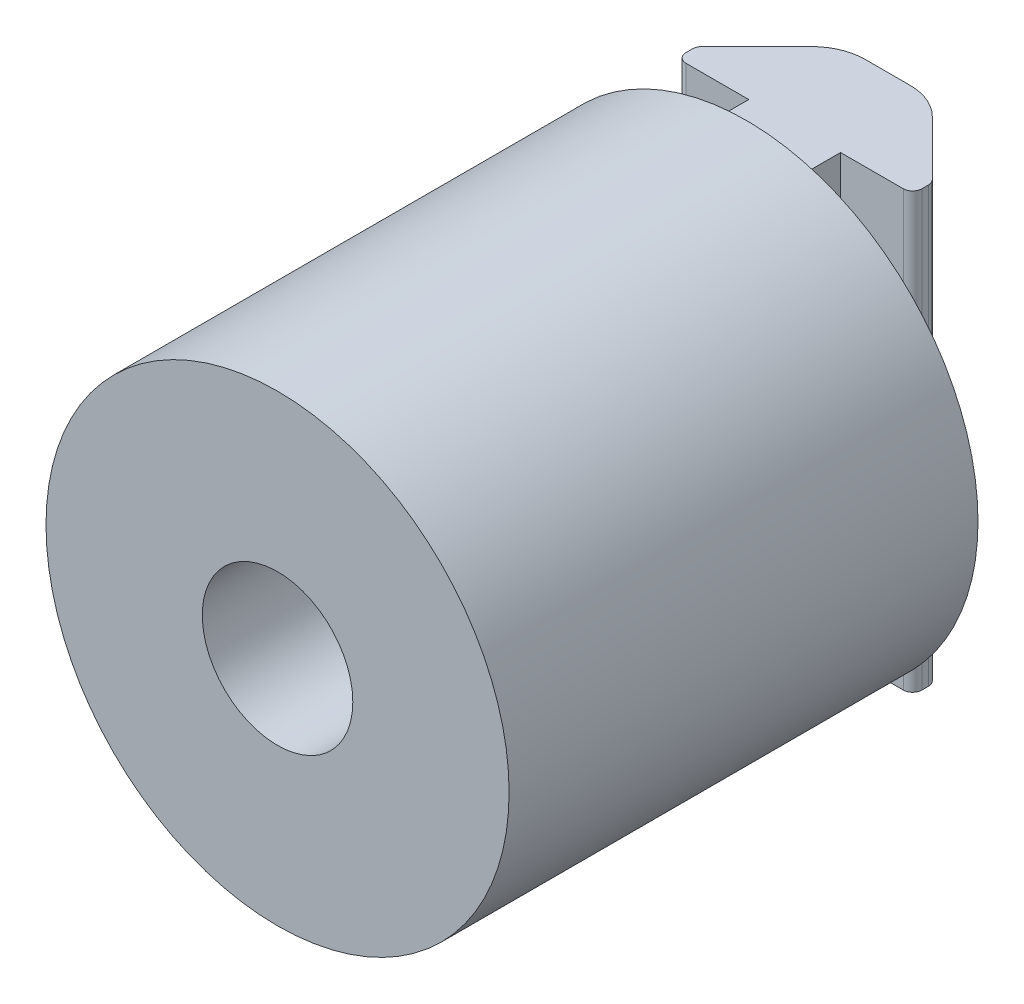
ISO-10303-21;
HEADER;
FILE_DESCRIPTION(('STEP AP214'),'2;1');
FILE_NAME('part.step','',(''),(''),'','','');
FILE_SCHEMA(('AUTOMOTIVE_DESIGN { 1 0 10303 214 1 1 1 1 }'));
ENDSEC;
DATA;
#1=APPLICATION_CONTEXT('core data for automotive mechanical design processes');
#2=APPLICATION_PROTOCOL_DEFINITION('international standard','automotive_design',2000,#1);
#3=PRODUCT_CONTEXT('',#1,'mechanical');
#4=PRODUCT('Part','Part','',(#3));
#5=PRODUCT_RELATED_PRODUCT_CATEGORY('part','',(#4));
#6=PRODUCT_DEFINITION_FORMATION('','',#4);
#7=PRODUCT_DEFINITION_CONTEXT('part definition',#1,'design');
#8=PRODUCT_DEFINITION('design','',#6,#7);
#9=PRODUCT_DEFINITION_SHAPE('','',#8);
#10=(LENGTH_UNIT() NAMED_UNIT(*) SI_UNIT(.MILLI.,.METRE.));
#11=(NAMED_UNIT(*) PLANE_ANGLE_UNIT() SI_UNIT($,.RADIAN.));
#12=(NAMED_UNIT(*) SI_UNIT($,.STERADIAN.) SOLID_ANGLE_UNIT());
#13=UNCERTAINTY_MEASURE_WITH_UNIT(LENGTH_MEASURE(1.E-05),#10,'distance_accuracy_value','');
#14=(GEOMETRIC_REPRESENTATION_CONTEXT(3) GLOBAL_UNCERTAINTY_ASSIGNED_CONTEXT((#13)) GLOBAL_UNIT_ASSIGNED_CONTEXT((#10,
#11,#12)) REPRESENTATION_CONTEXT('',''));
#15=CARTESIAN_POINT('',(0.,0.,0.));
#16=DIRECTION('',(0.,0.,1.));
#17=DIRECTION('',(1.,0.,0.));
#18=AXIS2_PLACEMENT_3D('',#15,#16,#17);
#19=CARTESIAN_POINT('',(0.,-20.,0.0999999999999792));
#20=DIRECTION('',(0.,0.,1.));
#21=DIRECTION('',(1.,0.,0.));
#22=AXIS2_PLACEMENT_3D('',#19,#20,#21);
#23=PLANE('',#22);
#24=CARTESIAN_POINT('',(0.,0.,0.0999999999999792));
#25=DIRECTION('',(0.,0.,1.));
#26=DIRECTION('',(1.,0.,0.));
#27=AXIS2_PLACEMENT_3D('',#24,#25,#26);
#28=CIRCLE('',#27,20.);
#29=CARTESIAN_POINT('',(-3.96399999999998,-19.6032319784264,0.0999999999999792));
#30=VERTEX_POINT('',#29);
#31=CARTESIAN_POINT('',(0.,-20.,0.0999999999999792));
#32=VERTEX_POINT('',#31);
#33=EDGE_CURVE('E204',#30,#32,#28,.T.);
#34=ORIENTED_EDGE('',*,*,#33,.F.);
#35=DIRECTION('',(0.,1.,0.));
#36=VECTOR('',#35,1.);
#37=CARTESIAN_POINT('',(-3.96399999999998,-20.,0.0999999999999792));
#38=LINE('',#37,#36);
#39=CARTESIAN_POINT('',(-3.96399999999998,-20.,0.0999999999999792));
#40=VERTEX_POINT('',#39);
#41=EDGE_CURVE('E202',#40,#30,#38,.T.);
#42=ORIENTED_EDGE('',*,*,#41,.F.);
#43=DIRECTION('',(1.,0.,0.));
#44=VECTOR('',#43,1.);
#45=CARTESIAN_POINT('',(0.,-20.,0.0999999999999792));
#46=LINE('',#45,#44);
#47=EDGE_CURVE('E283',#40,#32,#46,.T.);
#48=ORIENTED_EDGE('',*,*,#47,.T.);
#49=EDGE_LOOP('',(#34,#42,#48));
#50=FACE_BOUND('',#49,.T.);
#51=ADVANCED_FACE('F49',(#50),#23,.T.);
#52=CARTESIAN_POINT('',(0.,17.5,0.));
#53=DIRECTION('',(0.,1.,0.));
#54=DIRECTION('',(0.,0.,1.));
#55=AXIS2_PLACEMENT_3D('',#52,#53,#54);
#56=PLANE('',#55);
#57=DIRECTION('',(0.,0.,1.));
#58=VECTOR('',#57,1.);
#59=CARTESIAN_POINT('',(-3.96399999999998,17.5,0.));
#60=LINE('',#59,#58);
#61=CARTESIAN_POINT('',(-3.96399999999998,17.5,-4.16400000000002));
#62=VERTEX_POINT('',#61);
#63=CARTESIAN_POINT('',(-3.96399999999998,17.5,0.));
#64=VERTEX_POINT('',#63);
#65=EDGE_CURVE('E224',#62,#64,#60,.T.);
#66=ORIENTED_EDGE('',*,*,#65,.T.);
#67=DIRECTION('',(1.,0.,0.));
#68=VECTOR('',#67,1.);
#69=CARTESIAN_POINT('',(0.,17.5,0.));
#70=LINE('',#69,#68);
#71=CARTESIAN_POINT('',(3.96400000000002,17.5,0.));
#72=VERTEX_POINT('',#71);
#73=EDGE_CURVE('E58',#64,#72,#70,.T.);
#74=ORIENTED_EDGE('',*,*,#73,.T.);
#75=DIRECTION('',(0.,0.,-1.));
#76=VECTOR('',#75,1.);
#77=CARTESIAN_POINT('',(3.96400000000002,17.5,0.));
#78=LINE('',#77,#76);
#79=CARTESIAN_POINT('',(3.96400000000002,17.5,-4.16400000000002));
#80=VERTEX_POINT('',#79);
#81=EDGE_CURVE('E227',#72,#80,#78,.T.);
#82=ORIENTED_EDGE('',*,*,#81,.T.);
#83=DIRECTION('',(1.,0.,0.));
#84=VECTOR('',#83,1.);
#85=CARTESIAN_POINT('',(0.,17.5,-4.16400000000002));
#86=LINE('',#85,#84);
#87=CARTESIAN_POINT('',(9.38534251706002,17.5,-4.16400000000002));
#88=VERTEX_POINT('',#87);
#89=EDGE_CURVE('E230',#80,#88,#86,.T.);
#90=ORIENTED_EDGE('',*,*,#89,.T.);
#91=CARTESIAN_POINT('',(9.38534251706032,17.5,-4.96569999999972));
#92=DIRECTION('',(0.,1.,0.));
#93=DIRECTION('',(0.,0.,1.));
#94=AXIS2_PLACEMENT_3D('',#91,#92,#93);
#95=CIRCLE('',#94,0.801699999999698);
#96=CARTESIAN_POINT('',(10.18704251706,17.5,-4.96569999999972));
#97=VERTEX_POINT('',#96);
#98=EDGE_CURVE('E234',#88,#97,#95,.T.);
#99=ORIENTED_EDGE('',*,*,#98,.T.);
#100=DIRECTION('',(0.,0.,1.));
#101=VECTOR('',#100,1.);
#102=CARTESIAN_POINT('',(10.1870425170601,17.5,0.));
#103=LINE('',#102,#101);
#104=CARTESIAN_POINT('',(10.18704251706,17.5,-5.53395791189082));
#105=VERTEX_POINT('',#104);
#106=EDGE_CURVE('E238',#105,#97,#103,.T.);
#107=ORIENTED_EDGE('',*,*,#106,.F.);
#108=CARTESIAN_POINT('',(9.38534251706399,17.5,-5.53395791189082));
#109=DIRECTION('',(0.,1.,0.));
#110=DIRECTION('',(0.,0.,1.));
#111=AXIS2_PLACEMENT_3D('',#108,#109,#110);
#112=CIRCLE('',#111,0.80169999999602);
#113=CARTESIAN_POINT('',(9.95222932639803,17.5,-6.10084611550481));
#114=VERTEX_POINT('',#113);
#115=EDGE_CURVE('E242',#105,#114,#112,.T.);
#116=ORIENTED_EDGE('',*,*,#115,.T.);
#117=DIRECTION('',(0.707107650763137,0.,0.707105911608889));
#118=VECTOR('',#117,1.);
#119=CARTESIAN_POINT('',(8.02652548201141,17.5,-8.02654522356024));
#120=LINE('',#119,#118);
#121=CARTESIAN_POINT('',(5.22135465164394,17.5,-10.8317091545189));
#122=VERTEX_POINT('',#121);
#123=EDGE_CURVE('E246',#122,#114,#120,.T.);
#124=ORIENTED_EDGE('',*,*,#123,.F.);
#125=CARTESIAN_POINT('',(1.93345358384597,17.5,-7.5438000000015));
#126=DIRECTION('',(0.,1.,0.));
#127=DIRECTION('',(0.,0.,1.));
#128=AXIS2_PLACEMENT_3D('',#125,#126,#127);
#129=CIRCLE('',#128,4.64979999999852);
#130=CARTESIAN_POINT('',(1.93345358384597,17.5,-12.1936));
#131=VERTEX_POINT('',#130);
#132=EDGE_CURVE('E250',#122,#131,#129,.T.);
#133=ORIENTED_EDGE('',*,*,#132,.T.);
#134=DIRECTION('',(1.,0.,0.));
#135=VECTOR('',#134,1.);
#136=CARTESIAN_POINT('',(0.,17.5,-12.1936));
#137=LINE('',#136,#135);
#138=CARTESIAN_POINT('',(-1.93345358384594,17.5,-12.1936));
#139=VERTEX_POINT('',#138);
#140=EDGE_CURVE('E254',#139,#131,#137,.T.);
#141=ORIENTED_EDGE('',*,*,#140,.F.);
#142=CARTESIAN_POINT('',(-1.93345358384594,17.5,-7.54380000000146));
#143=DIRECTION('',(0.,1.,0.));
#144=DIRECTION('',(0.,0.,1.));
#145=AXIS2_PLACEMENT_3D('',#142,#143,#144);
#146=CIRCLE('',#145,4.64979999999856);
#147=CARTESIAN_POINT('',(-5.22135465164394,17.5,-10.8317091545189));
#148=VERTEX_POINT('',#147);
#149=EDGE_CURVE('E258',#139,#148,#146,.T.);
#150=ORIENTED_EDGE('',*,*,#149,.T.);
#151=DIRECTION('',(0.707107650763135,0.,-0.70710591160889));
#152=VECTOR('',#151,1.);
#153=CARTESIAN_POINT('',(-8.02652548201141,17.5,-8.02654522356021));
#154=LINE('',#153,#152);
#155=CARTESIAN_POINT('',(-9.952229326398,17.5,-6.10084611550481));
#156=VERTEX_POINT('',#155);
#157=EDGE_CURVE('E262',#156,#148,#154,.T.);
#158=ORIENTED_EDGE('',*,*,#157,.F.);
#159=CARTESIAN_POINT('',(-9.38534251706396,17.5,-5.53395791189082));
#160=DIRECTION('',(0.,1.,0.));
#161=DIRECTION('',(0.,0.,1.));
#162=AXIS2_PLACEMENT_3D('',#159,#160,#161);
#163=CIRCLE('',#162,0.801699999996017);
#164=CARTESIAN_POINT('',(-10.18704251706,17.5,-5.53395791189082));
#165=VERTEX_POINT('',#164);
#166=EDGE_CURVE('E266',#156,#165,#163,.T.);
#167=ORIENTED_EDGE('',*,*,#166,.T.);
#168=DIRECTION('',(0.,0.,-1.));
#169=VECTOR('',#168,1.);
#170=CARTESIAN_POINT('',(-10.18704251706,17.5,0.));
#171=LINE('',#170,#169);
#172=CARTESIAN_POINT('',(-10.18704251706,17.5,-4.96570000000002));
#173=VERTEX_POINT('',#172);
#174=EDGE_CURVE('E208',#173,#165,#171,.T.);
#175=ORIENTED_EDGE('',*,*,#174,.F.);
#176=CARTESIAN_POINT('',(-9.38534251706029,17.5,-4.96569999999972));
#177=DIRECTION('',(0.,1.,0.));
#178=DIRECTION('',(0.,0.,1.));
#179=AXIS2_PLACEMENT_3D('',#176,#177,#178);
#180=CIRCLE('',#179,0.801699999999693);
#181=CARTESIAN_POINT('',(-9.38534251706002,17.5,-4.16400000000002));
#182=VERTEX_POINT('',#181);
#183=EDGE_CURVE('E216',#173,#182,#180,.T.);
#184=ORIENTED_EDGE('',*,*,#183,.T.);
#185=DIRECTION('',(-1.,0.,0.));
#186=VECTOR('',#185,1.);
#187=CARTESIAN_POINT('',(0.,17.5,-4.16400000000001));
#188=LINE('',#187,#186);
#189=EDGE_CURVE('E220',#62,#182,#188,.T.);
#190=ORIENTED_EDGE('',*,*,#189,.F.);
#191=EDGE_LOOP('',(#66,#74,#82,#90,#99,#107,#116,#124,#133,#141,#150,#158,#167,#175,#184,#190));
#192=FACE_BOUND('',#191,.T.);
#193=ADVANCED_FACE('F378',(#192),#56,.T.);
#194=CARTESIAN_POINT('',(-10.18704251706,-20.,0.));
#195=DIRECTION('',(1.,0.,0.));
#196=DIRECTION('',(0.,0.,-1.));
#197=AXIS2_PLACEMENT_3D('',#194,#195,#196);
#198=PLANE('',#197);
#199=DIRECTION('',(0.,1.,0.));
#200=VECTOR('',#199,1.);
#201=CARTESIAN_POINT('',(-10.18704251706,-20.,-4.96570000000002));
#202=LINE('',#201,#200);
#203=CARTESIAN_POINT('',(-10.18704251706,-20.,-4.96570000000002));
#204=VERTEX_POINT('',#203);
#205=EDGE_CURVE('E327',#204,#173,#202,.T.);
#206=ORIENTED_EDGE('',*,*,#205,.T.);
#207=ORIENTED_EDGE('',*,*,#174,.T.);
#208=DIRECTION('',(0.,1.,0.));
#209=VECTOR('',#208,1.);
#210=CARTESIAN_POINT('',(-10.18704251706,-20.,-5.53395791189082));
#211=LINE('',#210,#209);
#212=CARTESIAN_POINT('',(-10.18704251706,-20.,-5.53395791189082));
#213=VERTEX_POINT('',#212);
#214=EDGE_CURVE('E328',#213,#165,#211,.T.);
#215=ORIENTED_EDGE('',*,*,#214,.F.);
#216=DIRECTION('',(0.,0.,-1.));
#217=VECTOR('',#216,1.);
#218=CARTESIAN_POINT('',(-10.18704251706,-20.,0.));
#219=LINE('',#218,#217);
#220=EDGE_CURVE('E73',#204,#213,#219,.T.);
#221=ORIENTED_EDGE('',*,*,#220,.F.);
#222=EDGE_LOOP('',(#206,#207,#215,#221));
#223=FACE_BOUND('',#222,.T.);
#224=ADVANCED_FACE('F51',(#223),#198,.F.);
#225=CARTESIAN_POINT('',(-9.38534251706396,-20.,-5.53395791189082));
#226=DIRECTION('',(0.,1.,0.));
#227=DIRECTION('',(0.,0.,1.));
#228=AXIS2_PLACEMENT_3D('',#225,#226,#227);
#229=CYLINDRICAL_SURFACE('',#228,0.801699999996017);
#230=ORIENTED_EDGE('',*,*,#214,.T.);
#231=ORIENTED_EDGE('',*,*,#166,.F.);
#232=DIRECTION('',(0.,1.,0.));
#233=VECTOR('',#232,1.);
#234=CARTESIAN_POINT('',(-9.952229326398,-20.,-6.10084611550481));
#235=LINE('',#234,#233);
#236=CARTESIAN_POINT('',(-9.952229326398,-20.,-6.10084611550481));
#237=VERTEX_POINT('',#236);
#238=EDGE_CURVE('E331',#237,#156,#235,.T.);
#239=ORIENTED_EDGE('',*,*,#238,.F.);
#240=CARTESIAN_POINT('',(-9.38534251706396,-20.,-5.53395791189082));
#241=DIRECTION('',(0.,1.,0.));
#242=DIRECTION('',(0.,0.,1.));
#243=AXIS2_PLACEMENT_3D('',#240,#241,#242);
#244=CIRCLE('',#243,0.801699999996017);
#245=EDGE_CURVE('E323',#237,#213,#244,.T.);
#246=ORIENTED_EDGE('',*,*,#245,.T.);
#247=EDGE_LOOP('',(#230,#231,#239,#246));
#248=FACE_BOUND('',#247,.T.);
#249=ADVANCED_FACE('F425',(#248),#229,.T.);
#250=CARTESIAN_POINT('',(-8.02652548201141,-20.,-8.02654522356021));
#251=DIRECTION('',(0.70710591160889,0.,0.707107650763135));
#252=DIRECTION('',(0.707107650763135,0.,-0.70710591160889));
#253=AXIS2_PLACEMENT_3D('',#250,#251,#252);
#254=PLANE('',#253);
#255=ORIENTED_EDGE('',*,*,#238,.T.);
#256=ORIENTED_EDGE('',*,*,#157,.T.);
#257=DIRECTION('',(0.,1.,0.));
#258=VECTOR('',#257,1.);
#259=CARTESIAN_POINT('',(-5.22135465164394,-20.,-10.8317091545189));
#260=LINE('',#259,#258);
#261=CARTESIAN_POINT('',(-5.22135465164394,-20.,-10.8317091545189));
#262=VERTEX_POINT('',#261);
#263=EDGE_CURVE('E334',#262,#148,#260,.T.);
#264=ORIENTED_EDGE('',*,*,#263,.F.);
#265=DIRECTION('',(0.707107650763135,0.,-0.70710591160889));
#266=VECTOR('',#265,1.);
#267=CARTESIAN_POINT('',(-8.02652548201141,-20.,-8.02654522356021));
#268=LINE('',#267,#266);
#269=EDGE_CURVE('E320',#237,#262,#268,.T.);
#270=ORIENTED_EDGE('',*,*,#269,.F.);
#271=EDGE_LOOP('',(#255,#256,#264,#270));
#272=FACE_BOUND('',#271,.T.);
#273=ADVANCED_FACE('F421',(#272),#254,.F.);
#274=CARTESIAN_POINT('',(-1.93345358384594,-20.,-7.54380000000146));
#275=DIRECTION('',(0.,1.,0.));
#276=DIRECTION('',(0.,0.,1.));
#277=AXIS2_PLACEMENT_3D('',#274,#275,#276);
#278=CYLINDRICAL_SURFACE('',#277,4.64979999999856);
#279=ORIENTED_EDGE('',*,*,#263,.T.);
#280=ORIENTED_EDGE('',*,*,#149,.F.);
#281=DIRECTION('',(0.,1.,0.));
#282=VECTOR('',#281,1.);
#283=CARTESIAN_POINT('',(-1.93345358384594,-20.,-12.1936));
#284=LINE('',#283,#282);
#285=CARTESIAN_POINT('',(-1.93345358384594,-20.,-12.1936));
#286=VERTEX_POINT('',#285);
#287=EDGE_CURVE('E337',#286,#139,#284,.T.);
#288=ORIENTED_EDGE('',*,*,#287,.F.);
#289=CARTESIAN_POINT('',(-1.93345358384594,-20.,-7.54380000000146));
#290=DIRECTION('',(0.,1.,0.));
#291=DIRECTION('',(0.,0.,1.));
#292=AXIS2_PLACEMENT_3D('',#289,#290,#291);
#293=CIRCLE('',#292,4.64979999999856);
#294=EDGE_CURVE('E316',#286,#262,#293,.T.);
#295=ORIENTED_EDGE('',*,*,#294,.T.);
#296=EDGE_LOOP('',(#279,#280,#288,#295));
#297=FACE_BOUND('',#296,.T.);
#298=ADVANCED_FACE('F417',(#297),#278,.T.);
#299=CARTESIAN_POINT('',(0.,-20.,-12.1936));
#300=DIRECTION('',(0.,0.,1.));
#301=DIRECTION('',(1.,0.,0.));
#302=AXIS2_PLACEMENT_3D('',#299,#300,#301);
#303=PLANE('',#302);
#304=ORIENTED_EDGE('',*,*,#287,.T.);
#305=ORIENTED_EDGE('',*,*,#140,.T.);
#306=DIRECTION('',(0.,1.,0.));
#307=VECTOR('',#306,1.);
#308=CARTESIAN_POINT('',(1.93345358384597,-20.,-12.1936));
#309=LINE('',#308,#307);
#310=CARTESIAN_POINT('',(1.93345358384597,-20.,-12.1936));
#311=VERTEX_POINT('',#310);
#312=EDGE_CURVE('E340',#311,#131,#309,.T.);
#313=ORIENTED_EDGE('',*,*,#312,.F.);
#314=DIRECTION('',(1.,0.,0.));
#315=VECTOR('',#314,1.);
#316=CARTESIAN_POINT('',(0.,-20.,-12.1936));
#317=LINE('',#316,#315);
#318=EDGE_CURVE('E313',#286,#311,#317,.T.);
#319=ORIENTED_EDGE('',*,*,#318,.F.);
#320=EDGE_LOOP('',(#304,#305,#313,#319));
#321=FACE_BOUND('',#320,.T.);
#322=ADVANCED_FACE('F412',(#321),#303,.F.);
#323=CARTESIAN_POINT('',(1.93345358384597,-20.,-7.5438000000015));
#324=DIRECTION('',(0.,1.,0.));
#325=DIRECTION('',(0.,0.,1.));
#326=AXIS2_PLACEMENT_3D('',#323,#324,#325);
#327=CYLINDRICAL_SURFACE('',#326,4.64979999999852);
#328=ORIENTED_EDGE('',*,*,#312,.T.);
#329=ORIENTED_EDGE('',*,*,#132,.F.);
#330=DIRECTION('',(0.,1.,0.));
#331=VECTOR('',#330,1.);
#332=CARTESIAN_POINT('',(5.22135465164394,-20.,-10.8317091545189));
#333=LINE('',#332,#331);
#334=CARTESIAN_POINT('',(5.22135465164394,-20.,-10.8317091545189));
#335=VERTEX_POINT('',#334);
#336=EDGE_CURVE('E343',#335,#122,#333,.T.);
#337=ORIENTED_EDGE('',*,*,#336,.F.);
#338=CARTESIAN_POINT('',(1.93345358384597,-20.,-7.5438000000015));
#339=DIRECTION('',(0.,1.,0.));
#340=DIRECTION('',(0.,0.,1.));
#341=AXIS2_PLACEMENT_3D('',#338,#339,#340);
#342=CIRCLE('',#341,4.64979999999852);
#343=EDGE_CURVE('E309',#335,#311,#342,.T.);
#344=ORIENTED_EDGE('',*,*,#343,.T.);
#345=EDGE_LOOP('',(#328,#329,#337,#344));
#346=FACE_BOUND('',#345,.T.);
#347=ADVANCED_FACE('F408',(#346),#327,.T.);
#348=CARTESIAN_POINT('',(8.02652548201141,-20.,-8.02654522356024));
#349=DIRECTION('',(-0.707105911608889,0.,0.707107650763137));
#350=DIRECTION('',(0.707107650763137,0.,0.707105911608889));
#351=AXIS2_PLACEMENT_3D('',#348,#349,#350);
#352=PLANE('',#351);
#353=ORIENTED_EDGE('',*,*,#336,.T.);
#354=ORIENTED_EDGE('',*,*,#123,.T.);
#355=DIRECTION('',(0.,1.,0.));
#356=VECTOR('',#355,1.);
#357=CARTESIAN_POINT('',(9.95222932639803,-20.,-6.10084611550481));
#358=LINE('',#357,#356);
#359=CARTESIAN_POINT('',(9.95222932639803,-20.,-6.10084611550481));
#360=VERTEX_POINT('',#359);
#361=EDGE_CURVE('E346',#360,#114,#358,.T.);
#362=ORIENTED_EDGE('',*,*,#361,.F.);
#363=DIRECTION('',(0.707107650763137,0.,0.707105911608889));
#364=VECTOR('',#363,1.);
#365=CARTESIAN_POINT('',(8.02652548201141,-20.,-8.02654522356024));
#366=LINE('',#365,#364);
#367=EDGE_CURVE('E306',#335,#360,#366,.T.);
#368=ORIENTED_EDGE('',*,*,#367,.F.);
#369=EDGE_LOOP('',(#353,#354,#362,#368));
#370=FACE_BOUND('',#369,.T.);
#371=ADVANCED_FACE('F403',(#370),#352,.F.);
#372=CARTESIAN_POINT('',(9.38534251706399,-20.,-5.53395791189082));
#373=DIRECTION('',(0.,1.,0.));
#374=DIRECTION('',(0.,0.,1.));
#375=AXIS2_PLACEMENT_3D('',#372,#373,#374);
#376=CYLINDRICAL_SURFACE('',#375,0.80169999999602);
#377=ORIENTED_EDGE('',*,*,#361,.T.);
#378=ORIENTED_EDGE('',*,*,#115,.F.);
#379=DIRECTION('',(0.,1.,0.));
#380=VECTOR('',#379,1.);
#381=CARTESIAN_POINT('',(10.18704251706,-20.,-5.53395791189082));
#382=LINE('',#381,#380);
#383=CARTESIAN_POINT('',(10.18704251706,-20.,-5.53395791189082));
#384=VERTEX_POINT('',#383);
#385=EDGE_CURVE('E349',#384,#105,#382,.T.);
#386=ORIENTED_EDGE('',*,*,#385,.F.);
#387=CARTESIAN_POINT('',(9.38534251706399,-20.,-5.53395791189082));
#388=DIRECTION('',(0.,1.,0.));
#389=DIRECTION('',(0.,0.,1.));
#390=AXIS2_PLACEMENT_3D('',#387,#388,#389);
#391=CIRCLE('',#390,0.80169999999602);
#392=EDGE_CURVE('E302',#384,#360,#391,.T.);
#393=ORIENTED_EDGE('',*,*,#392,.T.);
#394=EDGE_LOOP('',(#377,#378,#386,#393));
#395=FACE_BOUND('',#394,.T.);
#396=ADVANCED_FACE('F501',(#395),#376,.T.);
#397=CARTESIAN_POINT('',(10.1870425170601,-20.,0.));
#398=DIRECTION('',(-1.,0.,0.));
#399=DIRECTION('',(0.,0.,1.));
#400=AXIS2_PLACEMENT_3D('',#397,#398,#399);
#401=PLANE('',#400);
#402=ORIENTED_EDGE('',*,*,#385,.T.);
#403=ORIENTED_EDGE('',*,*,#106,.T.);
#404=DIRECTION('',(0.,1.,0.));
#405=VECTOR('',#404,1.);
#406=CARTESIAN_POINT('',(10.18704251706,-20.,-4.96569999999972));
#407=LINE('',#406,#405);
#408=CARTESIAN_POINT('',(10.18704251706,-20.,-4.96569999999972));
#409=VERTEX_POINT('',#408);
#410=EDGE_CURVE('E352',#409,#97,#407,.T.);
#411=ORIENTED_EDGE('',*,*,#410,.F.);
#412=DIRECTION('',(0.,0.,1.));
#413=VECTOR('',#412,1.);
#414=CARTESIAN_POINT('',(10.1870425170601,-20.,0.));
#415=LINE('',#414,#413);
#416=EDGE_CURVE('E299',#384,#409,#415,.T.);
#417=ORIENTED_EDGE('',*,*,#416,.F.);
#418=EDGE_LOOP('',(#402,#403,#411,#417));
#419=FACE_BOUND('',#418,.T.);
#420=ADVANCED_FACE('F396',(#419),#401,.F.);
#421=CARTESIAN_POINT('',(9.38534251706032,-20.,-4.96569999999972));
#422=DIRECTION('',(0.,1.,0.));
#423=DIRECTION('',(0.,0.,1.));
#424=AXIS2_PLACEMENT_3D('',#421,#422,#423);
#425=CYLINDRICAL_SURFACE('',#424,0.801699999999698);
#426=ORIENTED_EDGE('',*,*,#410,.T.);
#427=ORIENTED_EDGE('',*,*,#98,.F.);
#428=DIRECTION('',(0.,1.,0.));
#429=VECTOR('',#428,1.);
#430=CARTESIAN_POINT('',(9.38534251706002,-20.,-4.16400000000002));
#431=LINE('',#430,#429);
#432=CARTESIAN_POINT('',(9.38534251706002,-20.,-4.16400000000002));
#433=VERTEX_POINT('',#432);
#434=EDGE_CURVE('E355',#433,#88,#431,.T.);
#435=ORIENTED_EDGE('',*,*,#434,.F.);
#436=CARTESIAN_POINT('',(9.38534251706032,-20.,-4.96569999999972));
#437=DIRECTION('',(0.,1.,0.));
#438=DIRECTION('',(0.,0.,1.));
#439=AXIS2_PLACEMENT_3D('',#436,#437,#438);
#440=CIRCLE('',#439,0.801699999999698);
#441=EDGE_CURVE('E295',#433,#409,#440,.T.);
#442=ORIENTED_EDGE('',*,*,#441,.T.);
#443=EDGE_LOOP('',(#426,#427,#435,#442));
#444=FACE_BOUND('',#443,.T.);
#445=ADVANCED_FACE('F391',(#444),#425,.T.);
#446=CARTESIAN_POINT('',(0.,-20.,-4.16400000000002));
#447=DIRECTION('',(0.,0.,1.));
#448=DIRECTION('',(1.,0.,0.));
#449=AXIS2_PLACEMENT_3D('',#446,#447,#448);
#450=PLANE('',#449);
#451=ORIENTED_EDGE('',*,*,#434,.T.);
#452=ORIENTED_EDGE('',*,*,#89,.F.);
#453=DIRECTION('',(0.,1.,0.));
#454=VECTOR('',#453,1.);
#455=CARTESIAN_POINT('',(3.96400000000002,-20.,-4.16400000000002));
#456=LINE('',#455,#454);
#457=CARTESIAN_POINT('',(3.96400000000002,-20.,-4.16400000000002));
#458=VERTEX_POINT('',#457);
#459=EDGE_CURVE('E358',#458,#80,#456,.T.);
#460=ORIENTED_EDGE('',*,*,#459,.F.);
#461=DIRECTION('',(1.,0.,0.));
#462=VECTOR('',#461,1.);
#463=CARTESIAN_POINT('',(0.,-20.,-4.16400000000002));
#464=LINE('',#463,#462);
#465=EDGE_CURVE('E291',#458,#433,#464,.T.);
#466=ORIENTED_EDGE('',*,*,#465,.T.);
#467=EDGE_LOOP('',(#451,#452,#460,#466));
#468=FACE_BOUND('',#467,.T.);
#469=ADVANCED_FACE('F387',(#468),#450,.T.);
#470=CARTESIAN_POINT('',(3.96400000000002,-20.,0.));
#471=DIRECTION('',(1.,0.,0.));
#472=DIRECTION('',(0.,0.,-1.));
#473=AXIS2_PLACEMENT_3D('',#470,#471,#472);
#474=PLANE('',#473);
#475=DIRECTION('',(0.,0.,1.));
#476=VECTOR('',#475,1.);
#477=CARTESIAN_POINT('',(3.96400000000002,-19.6032319784264,0.));
#478=LINE('',#477,#476);
#479=CARTESIAN_POINT('',(3.96400000000002,-19.6032319784264,0.0999999999999792));
#480=VERTEX_POINT('',#479);
#481=CARTESIAN_POINT('',(3.96400000000002,-19.6032319784264,0.));
#482=VERTEX_POINT('',#481);
#483=EDGE_CURVE('E195',#480,#482,#478,.F.);
#484=ORIENTED_EDGE('',*,*,#483,.F.);
#485=DIRECTION('',(0.,1.,0.));
#486=VECTOR('',#485,1.);
#487=CARTESIAN_POINT('',(3.96400000000002,-20.,0.0999999999999792));
#488=LINE('',#487,#486);
#489=CARTESIAN_POINT('',(3.96400000000002,-20.,0.0999999999999792));
#490=VERTEX_POINT('',#489);
#491=EDGE_CURVE('E362',#490,#480,#488,.T.);
#492=ORIENTED_EDGE('',*,*,#491,.F.);
#493=DIRECTION('',(0.,0.,-1.));
#494=VECTOR('',#493,1.);
#495=CARTESIAN_POINT('',(3.96400000000002,-20.,0.));
#496=LINE('',#495,#494);
#497=EDGE_CURVE('E287',#490,#458,#496,.T.);
#498=ORIENTED_EDGE('',*,*,#497,.T.);
#499=ORIENTED_EDGE('',*,*,#459,.T.);
#500=ORIENTED_EDGE('',*,*,#81,.F.);
#501=DIRECTION('',(0.,-1.,0.));
#502=VECTOR('',#501,1.);
#503=CARTESIAN_POINT('',(3.96400000000002,-20.,0.));
#504=LINE('',#503,#502);
#505=EDGE_CURVE('E65',#72,#482,#504,.T.);
#506=ORIENTED_EDGE('',*,*,#505,.T.);
#507=EDGE_LOOP('',(#484,#492,#498,#499,#500,#506));
#508=FACE_BOUND('',#507,.T.);
#509=ADVANCED_FACE('F381',(#508),#474,.T.);
#510=EDGE_CURVE('E210',#32,#480,#28,.T.);
#511=ORIENTED_EDGE('',*,*,#510,.F.);
#512=EDGE_CURVE('E282',#32,#490,#46,.T.);
#513=ORIENTED_EDGE('',*,*,#512,.T.);
#514=ORIENTED_EDGE('',*,*,#491,.T.);
#515=EDGE_LOOP('',(#511,#513,#514));
#516=FACE_BOUND('',#515,.T.);
#517=ADVANCED_FACE('F442',(#516),#23,.T.);
#518=CARTESIAN_POINT('',(-3.96399999999998,-20.,0.));
#519=DIRECTION('',(-1.,0.,0.));
#520=DIRECTION('',(0.,0.,1.));
#521=AXIS2_PLACEMENT_3D('',#518,#519,#520);
#522=PLANE('',#521);
#523=DIRECTION('',(0.,0.,1.));
#524=VECTOR('',#523,1.);
#525=CARTESIAN_POINT('',(-3.96399999999998,-19.6032319784264,0.));
#526=LINE('',#525,#524);
#527=CARTESIAN_POINT('',(-3.96399999999998,-19.6032319784264,0.));
#528=VERTEX_POINT('',#527);
#529=EDGE_CURVE('E192',#528,#30,#526,.T.);
#530=ORIENTED_EDGE('',*,*,#529,.F.);
#531=DIRECTION('',(0.,1.,0.));
#532=VECTOR('',#531,1.);
#533=CARTESIAN_POINT('',(-3.96399999999998,-20.,0.));
#534=LINE('',#533,#532);
#535=EDGE_CURVE('E179',#528,#64,#534,.T.);
#536=ORIENTED_EDGE('',*,*,#535,.T.);
#537=ORIENTED_EDGE('',*,*,#65,.F.);
#538=DIRECTION('',(0.,1.,0.));
#539=VECTOR('',#538,1.);
#540=CARTESIAN_POINT('',(-3.96399999999998,-20.,-4.16400000000002));
#541=LINE('',#540,#539);
#542=CARTESIAN_POINT('',(-3.96399999999998,-20.,-4.16400000000002));
#543=VERTEX_POINT('',#542);
#544=EDGE_CURVE('E368',#543,#62,#541,.T.);
#545=ORIENTED_EDGE('',*,*,#544,.F.);
#546=DIRECTION('',(0.,0.,1.));
#547=VECTOR('',#546,1.);
#548=CARTESIAN_POINT('',(-3.96399999999998,-20.,0.));
#549=LINE('',#548,#547);
#550=EDGE_CURVE('E279',#543,#40,#549,.T.);
#551=ORIENTED_EDGE('',*,*,#550,.T.);
#552=ORIENTED_EDGE('',*,*,#41,.T.);
#553=EDGE_LOOP('',(#530,#536,#537,#545,#551,#552));
#554=FACE_BOUND('',#553,.T.);
#555=ADVANCED_FACE('F200',(#554),#522,.T.);
#556=CARTESIAN_POINT('',(0.,-20.,-4.16400000000001));
#557=DIRECTION('',(0.,0.,-1.));
#558=DIRECTION('',(-1.,0.,0.));
#559=AXIS2_PLACEMENT_3D('',#556,#557,#558);
#560=PLANE('',#559);
#561=ORIENTED_EDGE('',*,*,#544,.T.);
#562=ORIENTED_EDGE('',*,*,#189,.T.);
#563=DIRECTION('',(0.,1.,0.));
#564=VECTOR('',#563,1.);
#565=CARTESIAN_POINT('',(-9.38534251706002,-20.,-4.16400000000002));
#566=LINE('',#565,#564);
#567=CARTESIAN_POINT('',(-9.38534251706002,-20.,-4.16400000000002));
#568=VERTEX_POINT('',#567);
#569=EDGE_CURVE('E371',#568,#182,#566,.T.);
#570=ORIENTED_EDGE('',*,*,#569,.F.);
#571=DIRECTION('',(-1.,0.,0.));
#572=VECTOR('',#571,1.);
#573=CARTESIAN_POINT('',(0.,-20.,-4.16400000000001));
#574=LINE('',#573,#572);
#575=EDGE_CURVE('E276',#543,#568,#574,.T.);
#576=ORIENTED_EDGE('',*,*,#575,.F.);
#577=EDGE_LOOP('',(#561,#562,#570,#576));
#578=FACE_BOUND('',#577,.T.);
#579=ADVANCED_FACE('F433',(#578),#560,.F.);
#580=CARTESIAN_POINT('',(-9.38534251706029,-20.,-4.96569999999972));
#581=DIRECTION('',(0.,1.,0.));
#582=DIRECTION('',(0.,0.,1.));
#583=AXIS2_PLACEMENT_3D('',#580,#581,#582);
#584=CYLINDRICAL_SURFACE('',#583,0.801699999999693);
#585=ORIENTED_EDGE('',*,*,#569,.T.);
#586=ORIENTED_EDGE('',*,*,#183,.F.);
#587=ORIENTED_EDGE('',*,*,#205,.F.);
#588=CARTESIAN_POINT('',(-9.38534251706029,-20.,-4.96569999999972));
#589=DIRECTION('',(0.,1.,0.));
#590=DIRECTION('',(0.,0.,1.));
#591=AXIS2_PLACEMENT_3D('',#588,#589,#590);
#592=CIRCLE('',#591,0.801699999999693);
#593=EDGE_CURVE('E272',#204,#568,#592,.T.);
#594=ORIENTED_EDGE('',*,*,#593,.T.);
#595=EDGE_LOOP('',(#585,#586,#587,#594));
#596=FACE_BOUND('',#595,.T.);
#597=ADVANCED_FACE('F430',(#596),#584,.T.);
#598=CARTESIAN_POINT('',(0.,-20.,0.));
#599=DIRECTION('',(0.,1.,0.));
#600=DIRECTION('',(0.,0.,1.));
#601=AXIS2_PLACEMENT_3D('',#598,#599,#600);
#602=PLANE('',#601);
#603=ORIENTED_EDGE('',*,*,#512,.F.);
#604=ORIENTED_EDGE('',*,*,#47,.F.);
#605=ORIENTED_EDGE('',*,*,#550,.F.);
#606=ORIENTED_EDGE('',*,*,#575,.T.);
#607=ORIENTED_EDGE('',*,*,#593,.F.);
#608=ORIENTED_EDGE('',*,*,#220,.T.);
#609=ORIENTED_EDGE('',*,*,#245,.F.);
#610=ORIENTED_EDGE('',*,*,#269,.T.);
#611=ORIENTED_EDGE('',*,*,#294,.F.);
#612=ORIENTED_EDGE('',*,*,#318,.T.);
#613=ORIENTED_EDGE('',*,*,#343,.F.);
#614=ORIENTED_EDGE('',*,*,#367,.T.);
#615=ORIENTED_EDGE('',*,*,#392,.F.);
#616=ORIENTED_EDGE('',*,*,#416,.T.);
#617=ORIENTED_EDGE('',*,*,#441,.F.);
#618=ORIENTED_EDGE('',*,*,#465,.F.);
#619=ORIENTED_EDGE('',*,*,#497,.F.);
#620=EDGE_LOOP('',(#603,#604,#605,#606,#607,#608,#609,#610,#611,#612,#613,#614,#615,#616,#617,
#618,#619));
#621=FACE_BOUND('',#620,.T.);
#622=ADVANCED_FACE('F438',(#621),#602,.F.);
#623=CARTESIAN_POINT('',(0.,0.,0.));
#624=DIRECTION('',(0.,0.,1.));
#625=DIRECTION('',(1.,0.,0.));
#626=AXIS2_PLACEMENT_3D('',#623,#624,#625);
#627=CYLINDRICAL_SURFACE('',#626,20.);
#628=ORIENTED_EDGE('',*,*,#529,.T.);
#629=ORIENTED_EDGE('',*,*,#33,.T.);
#630=ORIENTED_EDGE('',*,*,#510,.T.);
#631=ORIENTED_EDGE('',*,*,#483,.T.);
#632=CARTESIAN_POINT('',(0.,0.,0.));
#633=DIRECTION('',(0.,0.,1.));
#634=DIRECTION('',(1.,0.,0.));
#635=AXIS2_PLACEMENT_3D('',#632,#633,#634);
#636=CIRCLE('',#635,20.);
#637=EDGE_CURVE('E182',#482,#528,#636,.T.);
#638=ORIENTED_EDGE('',*,*,#637,.T.);
#639=EDGE_LOOP('',(#628,#629,#630,#631,#638));
#640=FACE_BOUND('',#639,.T.);
#641=CARTESIAN_POINT('',(0.,0.,40.5));
#642=DIRECTION('',(0.,0.,1.));
#643=DIRECTION('',(1.,0.,0.));
#644=AXIS2_PLACEMENT_3D('',#641,#642,#643);
#645=CIRCLE('',#644,20.);
#646=CARTESIAN_POINT('',(20.,0.,40.5));
#647=VERTEX_POINT('',#646);
#648=EDGE_CURVE('E450',#647,#647,#645,.T.);
#649=ORIENTED_EDGE('',*,*,#648,.F.);
#650=EDGE_LOOP('',(#649));
#651=FACE_BOUND('',#650,.T.);
#652=ADVANCED_FACE('F190',(#640,#651),#627,.T.);
#653=CARTESIAN_POINT('',(0.,0.,0.));
#654=DIRECTION('',(0.,0.,1.));
#655=DIRECTION('',(1.,0.,0.));
#656=AXIS2_PLACEMENT_3D('',#653,#654,#655);
#657=PLANE('',#656);
#658=ORIENTED_EDGE('',*,*,#505,.F.);
#659=ORIENTED_EDGE('',*,*,#73,.F.);
#660=ORIENTED_EDGE('',*,*,#535,.F.);
#661=ORIENTED_EDGE('',*,*,#637,.F.);
#662=EDGE_LOOP('',(#658,#659,#660,#661));
#663=FACE_BOUND('',#662,.T.);
#664=ADVANCED_FACE('F181',(#663),#657,.F.);
#665=CARTESIAN_POINT('',(0.,0.,20.5));
#666=DIRECTION('',(0.,0.,1.));
#667=DIRECTION('',(1.,0.,0.));
#668=AXIS2_PLACEMENT_3D('',#665,#666,#667);
#669=PLANE('',#668);
#670=CARTESIAN_POINT('',(0.,0.,20.5));
#671=DIRECTION('',(0.,0.,1.));
#672=DIRECTION('',(1.,0.,0.));
#673=AXIS2_PLACEMENT_3D('',#670,#671,#672);
#674=CIRCLE('',#673,6.5);
#675=CARTESIAN_POINT('',(6.5,0.,20.5));
#676=VERTEX_POINT('',#675);
#677=EDGE_CURVE('E455',#676,#676,#674,.T.);
#678=ORIENTED_EDGE('',*,*,#677,.T.);
#679=EDGE_LOOP('',(#678));
#680=FACE_BOUND('',#679,.T.);
#681=CARTESIAN_POINT('',(0.,0.,20.5));
#682=DIRECTION('',(0.,0.,1.));
#683=DIRECTION('',(1.,0.,0.));
#684=AXIS2_PLACEMENT_3D('',#681,#682,#683);
#685=CIRCLE('',#684,12.5);
#686=CARTESIAN_POINT('',(-12.5,0.,20.5));
#687=VERTEX_POINT('',#686);
#688=EDGE_CURVE('E197',#687,#687,#685,.T.);
#689=ORIENTED_EDGE('',*,*,#688,.F.);
#690=EDGE_LOOP('',(#689));
#691=FACE_BOUND('',#690,.T.);
#692=ADVANCED_FACE('F468',(#680,#691),#669,.F.);
#693=CARTESIAN_POINT('',(0.,0.,40.5));
#694=DIRECTION('',(0.,0.,1.));
#695=DIRECTION('',(1.,0.,0.));
#696=AXIS2_PLACEMENT_3D('',#693,#694,#695);
#697=PLANE('',#696);
#698=ORIENTED_EDGE('',*,*,#648,.T.);
#699=EDGE_LOOP('',(#698));
#700=FACE_BOUND('',#699,.T.);
#701=CARTESIAN_POINT('',(0.,0.,40.5));
#702=DIRECTION('',(0.,0.,1.));
#703=DIRECTION('',(1.,0.,0.));
#704=AXIS2_PLACEMENT_3D('',#701,#702,#703);
#705=CIRCLE('',#704,6.5);
#706=CARTESIAN_POINT('',(6.5,0.,40.5));
#707=VERTEX_POINT('',#706);
#708=EDGE_CURVE('E454',#707,#707,#705,.T.);
#709=ORIENTED_EDGE('',*,*,#708,.F.);
#710=EDGE_LOOP('',(#709));
#711=FACE_BOUND('',#710,.T.);
#712=ADVANCED_FACE('F466',(#700,#711),#697,.T.);
#713=CARTESIAN_POINT('',(0.,0.,40.5));
#714=DIRECTION('',(0.,0.,-1.));
#715=DIRECTION('',(-1.,0.,0.));
#716=AXIS2_PLACEMENT_3D('',#713,#714,#715);
#717=CYLINDRICAL_SURFACE('',#716,6.5);
#718=ORIENTED_EDGE('',*,*,#708,.T.);
#719=EDGE_LOOP('',(#718));
#720=FACE_BOUND('',#719,.T.);
#721=ORIENTED_EDGE('',*,*,#677,.F.);
#722=EDGE_LOOP('',(#721));
#723=FACE_BOUND('',#722,.T.);
#724=ADVANCED_FACE('F463',(#720,#723),#717,.F.);
#725=CARTESIAN_POINT('',(0.,0.,10.));
#726=DIRECTION('',(0.,0.,1.));
#727=DIRECTION('',(1.,0.,0.));
#728=AXIS2_PLACEMENT_3D('',#725,#726,#727);
#729=PLANE('',#728);
#730=CARTESIAN_POINT('',(0.,0.,10.));
#731=DIRECTION('',(0.,0.,1.));
#732=DIRECTION('',(1.,0.,0.));
#733=AXIS2_PLACEMENT_3D('',#730,#731,#732);
#734=CIRCLE('',#733,12.5);
#735=CARTESIAN_POINT('',(-12.5,0.,10.));
#736=VERTEX_POINT('',#735);
#737=EDGE_CURVE('E11',#736,#736,#734,.F.);
#738=ORIENTED_EDGE('',*,*,#737,.F.);
#739=EDGE_LOOP('',(#738));
#740=FACE_BOUND('',#739,.T.);
#741=ADVANCED_FACE('F475',(#740),#729,.T.);
#742=CARTESIAN_POINT('',(0.,0.,20.5));
#743=DIRECTION('',(0.,0.,-1.));
#744=DIRECTION('',(-1.,0.,0.));
#745=AXIS2_PLACEMENT_3D('',#742,#743,#744);
#746=CYLINDRICAL_SURFACE('',#745,12.5);
#747=CARTESIAN_POINT('',(-12.5,0.,20.5));
#748=CARTESIAN_POINT('',(-12.5,0.,20.390625));
#749=CARTESIAN_POINT('',(-12.5,0.,20.28125));
#750=CARTESIAN_POINT('',(-12.5,0.,20.0625));
#751=CARTESIAN_POINT('',(-12.5,0.,19.953125));
#752=CARTESIAN_POINT('',(-12.5,0.,19.734375));
#753=CARTESIAN_POINT('',(-12.5,0.,19.625));
#754=CARTESIAN_POINT('',(-12.5,0.,19.40625));
#755=CARTESIAN_POINT('',(-12.5,0.,19.296875));
#756=CARTESIAN_POINT('',(-12.5,0.,19.078125));
#757=CARTESIAN_POINT('',(-12.5,0.,18.96875));
#758=CARTESIAN_POINT('',(-12.5,0.,18.75));
#759=CARTESIAN_POINT('',(-12.5,0.,18.640625));
#760=CARTESIAN_POINT('',(-12.5,0.,18.421875));
#761=CARTESIAN_POINT('',(-12.5,0.,18.3125));
#762=CARTESIAN_POINT('',(-12.5,0.,18.09375));
#763=CARTESIAN_POINT('',(-12.5,0.,17.984375));
#764=CARTESIAN_POINT('',(-12.5,0.,17.765625));
#765=CARTESIAN_POINT('',(-12.5,0.,17.65625));
#766=CARTESIAN_POINT('',(-12.5,0.,17.4375));
#767=CARTESIAN_POINT('',(-12.5,0.,17.328125));
#768=CARTESIAN_POINT('',(-12.5,0.,17.109375));
#769=CARTESIAN_POINT('',(-12.5,0.,17.));
#770=CARTESIAN_POINT('',(-12.5,0.,16.78125));
#771=CARTESIAN_POINT('',(-12.5,0.,16.671875));
#772=CARTESIAN_POINT('',(-12.5,0.,16.453125));
#773=CARTESIAN_POINT('',(-12.5,0.,16.34375));
#774=CARTESIAN_POINT('',(-12.5,0.,16.125));
#775=CARTESIAN_POINT('',(-12.5,0.,16.015625));
#776=CARTESIAN_POINT('',(-12.5,0.,15.796875));
#777=CARTESIAN_POINT('',(-12.5,0.,15.6875));
#778=CARTESIAN_POINT('',(-12.5,0.,15.46875));
#779=CARTESIAN_POINT('',(-12.5,0.,15.359375));
#780=CARTESIAN_POINT('',(-12.5,0.,15.140625));
#781=CARTESIAN_POINT('',(-12.5,0.,15.03125));
#782=CARTESIAN_POINT('',(-12.5,0.,14.8125));
#783=CARTESIAN_POINT('',(-12.5,0.,14.703125));
#784=CARTESIAN_POINT('',(-12.5,0.,14.484375));
#785=CARTESIAN_POINT('',(-12.5,0.,14.375));
#786=CARTESIAN_POINT('',(-12.5,0.,14.15625));
#787=CARTESIAN_POINT('',(-12.5,0.,14.046875));
#788=CARTESIAN_POINT('',(-12.5,0.,13.828125));
#789=CARTESIAN_POINT('',(-12.5,0.,13.71875));
#790=CARTESIAN_POINT('',(-12.5,0.,13.5));
#791=CARTESIAN_POINT('',(-12.5,0.,13.390625));
#792=CARTESIAN_POINT('',(-12.5,0.,13.171875));
#793=CARTESIAN_POINT('',(-12.5,0.,13.0625));
#794=CARTESIAN_POINT('',(-12.5,0.,12.84375));
#795=CARTESIAN_POINT('',(-12.5,0.,12.734375));
#796=CARTESIAN_POINT('',(-12.5,0.,12.515625));
#797=CARTESIAN_POINT('',(-12.5,0.,12.40625));
#798=CARTESIAN_POINT('',(-12.5,0.,12.1875));
#799=CARTESIAN_POINT('',(-12.5,0.,12.078125));
#800=CARTESIAN_POINT('',(-12.5,0.,11.859375));
#801=CARTESIAN_POINT('',(-12.5,0.,11.75));
#802=CARTESIAN_POINT('',(-12.5,0.,11.53125));
#803=CARTESIAN_POINT('',(-12.5,0.,11.421875));
#804=CARTESIAN_POINT('',(-12.5,0.,11.203125));
#805=CARTESIAN_POINT('',(-12.5,0.,11.09375));
#806=CARTESIAN_POINT('',(-12.5,0.,10.875));
#807=CARTESIAN_POINT('',(-12.5,0.,10.765625));
#808=CARTESIAN_POINT('',(-12.5,0.,10.546875));
#809=CARTESIAN_POINT('',(-12.5,0.,10.4375));
#810=CARTESIAN_POINT('',(-12.5,0.,10.21875));
#811=CARTESIAN_POINT('',(-12.5,0.,10.109375));
#812=CARTESIAN_POINT('',(-12.5,0.,10.));
#813=B_SPLINE_CURVE_WITH_KNOTS('',3,(#747,#748,#749,#750,#751,#752,#753,#754,#755,#756,#757,
#758,#759,#760,#761,#762,#763,#764,#765,#766,#767,#768,#769,#770,#771,#772,#773,#774,#775,#776,
#777,#778,#779,#780,#781,#782,#783,#784,#785,#786,#787,#788,#789,#790,#791,#792,#793,#794,#795,
#796,#797,#798,#799,#800,#801,#802,#803,#804,#805,#806,#807,#808,#809,#810,#811,#812),
.UNSPECIFIED.,.F.,.F.,(4,2,2,2,2,2,2,2,2,2,2,2,2,2,2,2,2,2,2,2,2,2,2,2,2,2,2,2,2,2,2,2,4),(0.,
0.328124999999999,0.656249999999997,0.984374999999999,1.3125,1.640625,1.96875,2.296875,2.625,
2.953125,3.28125,3.609375,3.9375,4.265625,4.59375,4.921875,5.25,5.578125,5.90625,6.234375,
6.5625,6.890625,7.21875,7.546875,7.875,8.203125,8.53125,8.859375,9.1875,9.515625,9.84375,
10.171875,10.5),.UNSPECIFIED.);
#814=EDGE_CURVE('BSEAM524',#687,#736,#813,.T.);
#815=ORIENTED_EDGE('',*,*,#688,.T.);
#816=ORIENTED_EDGE('',*,*,#737,.T.);
#817=ORIENTED_EDGE('',*,*,#814,.T.);
#818=ORIENTED_EDGE('',*,*,#814,.F.);
#819=EDGE_LOOP('',(#815,#817,#816,#818));
#820=FACE_BOUND('',#819,.T.);
#821=ADVANCED_FACE('F524',(#820),#746,.F.);
#822=CLOSED_SHELL('',(#51,#193,#224,#249,#273,#298,#322,#347,#371,#396,#420,#445,#469,#509,#517,
#555,#579,#597,#622,#652,#664,#692,#712,#724,#741,#821));
#823=MANIFOLD_SOLID_BREP('B2',#822);
#824=ADVANCED_BREP_SHAPE_REPRESENTATION('',(#18,#823),#14);
#825=SHAPE_DEFINITION_REPRESENTATION(#9,#824);
ENDSEC;
END-ISO-10303-21;
